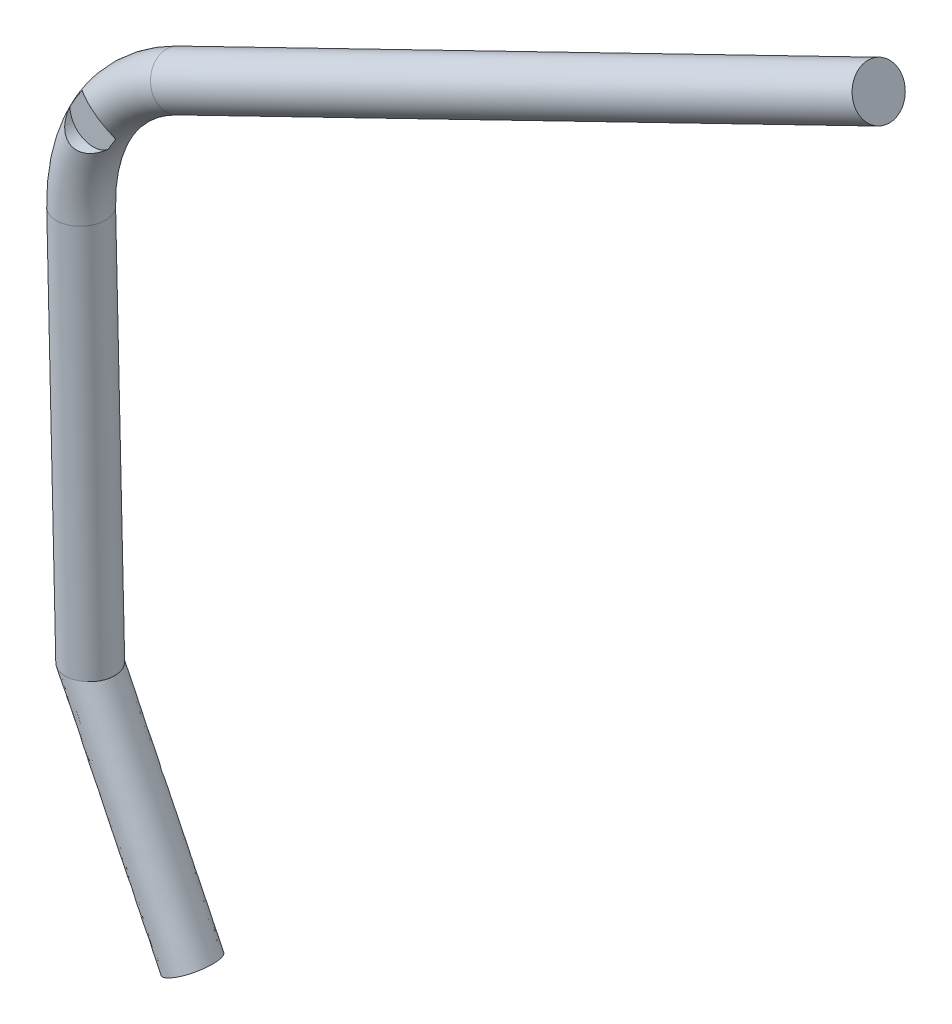
ISO-10303-21;
HEADER;
FILE_DESCRIPTION(('STEP AP214'),'2;1');
FILE_NAME('part.step','',(''),(''),'','','');
FILE_SCHEMA(('AUTOMOTIVE_DESIGN { 1 0 10303 214 1 1 1 1 }'));
ENDSEC;
DATA;
#1=APPLICATION_CONTEXT('core data for automotive mechanical design processes');
#2=APPLICATION_PROTOCOL_DEFINITION('international standard','automotive_design',2000,#1);
#3=PRODUCT_CONTEXT('',#1,'mechanical');
#4=PRODUCT('Part','Part','',(#3));
#5=PRODUCT_RELATED_PRODUCT_CATEGORY('part','',(#4));
#6=PRODUCT_DEFINITION_FORMATION('','',#4);
#7=PRODUCT_DEFINITION_CONTEXT('part definition',#1,'design');
#8=PRODUCT_DEFINITION('design','',#6,#7);
#9=PRODUCT_DEFINITION_SHAPE('','',#8);
#10=(LENGTH_UNIT() NAMED_UNIT(*) SI_UNIT(.MILLI.,.METRE.));
#11=(NAMED_UNIT(*) PLANE_ANGLE_UNIT() SI_UNIT($,.RADIAN.));
#12=(NAMED_UNIT(*) SI_UNIT($,.STERADIAN.) SOLID_ANGLE_UNIT());
#13=UNCERTAINTY_MEASURE_WITH_UNIT(LENGTH_MEASURE(1.E-05),#10,'distance_accuracy_value','');
#14=(GEOMETRIC_REPRESENTATION_CONTEXT(3) GLOBAL_UNCERTAINTY_ASSIGNED_CONTEXT((#13)) GLOBAL_UNIT_ASSIGNED_CONTEXT((#10,
#11,#12)) REPRESENTATION_CONTEXT('',''));
#15=CARTESIAN_POINT('',(0.,0.,0.));
#16=DIRECTION('',(0.,0.,1.));
#17=DIRECTION('',(1.,0.,0.));
#18=AXIS2_PLACEMENT_3D('',#15,#16,#17);
#19=CARTESIAN_POINT('',(0.,0.,0.));
#20=DIRECTION('',(0.,0.,-1.));
#21=DIRECTION('',(-1.,0.,0.));
#22=AXIS2_PLACEMENT_3D('',#19,#20,#21);
#23=TOROIDAL_SURFACE('',#22,88.8758294599473,12.7);
#24=CARTESIAN_POINT('',(-87.7998132979422,50.0474143105984,3.57553745923136));
#25=CARTESIAN_POINT('',(-87.8299343884214,49.9496602388808,3.65134952302277));
#26=CARTESIAN_POINT('',(-87.8586537249685,49.8520629381201,3.72790477899603));
#27=CARTESIAN_POINT('',(-87.913394427294,49.6570338451541,3.88216847786201));
#28=CARTESIAN_POINT('',(-87.9394159847046,49.5596020416772,3.95987683839702));
#29=CARTESIAN_POINT('',(-88.0135880585861,49.2673527472721,4.19421558928203));
#30=CARTESIAN_POINT('',(-88.0578584631124,49.0725406865161,4.35209157645596));
#31=CARTESIAN_POINT('',(-88.136518230025,48.6821553229928,4.66953367030395));
#32=CARTESIAN_POINT('',(-88.1709028266383,48.4865816989811,4.8291005538253));
#33=CARTESIAN_POINT('',(-88.2299477009155,48.0944037382683,5.14876532855746));
#34=CARTESIAN_POINT('',(-88.2546074586819,47.8977993470309,5.30886324769659));
#35=CARTESIAN_POINT('',(-88.3144020102499,47.3028440239459,5.79140496282401));
#36=CARTESIAN_POINT('',(-88.3347040676355,46.9025654278798,6.11344709521728));
#37=CARTESIAN_POINT('',(-88.3350722177534,46.0973182067698,6.75145712930284));
#38=CARTESIAN_POINT('',(-88.3151483084676,45.6923507719888,7.06742652064262));
#39=CARTESIAN_POINT('',(-88.2398999918382,44.9449226361917,7.63917100679886));
#40=CARTESIAN_POINT('',(-88.1908268532016,44.6029531575659,7.89641181514147));
#41=CARTESIAN_POINT('',(-88.061777401501,43.9179879232989,8.40172693100896));
#42=CARTESIAN_POINT('',(-87.9818008179172,43.5749921586999,8.64980115827145));
#43=CARTESIAN_POINT('',(-87.7896643144737,42.8907747760442,9.13359090619045));
#44=CARTESIAN_POINT('',(-87.6775966007258,42.5495508867415,9.36933957850497));
#45=CARTESIAN_POINT('',(-87.419552881972,41.8702593325803,9.82638616496691));
#46=CARTESIAN_POINT('',(-87.273586757567,41.5321907778249,10.0476882659218));
#47=CARTESIAN_POINT('',(-86.9867760067517,40.9452528609873,10.4198829713868));
#48=CARTESIAN_POINT('',(-86.853633944676,40.6950490634719,10.5746289765622));
#49=CARTESIAN_POINT('',(-86.5666715515749,40.1996000175536,10.8725241471734));
#50=CARTESIAN_POINT('',(-86.4128527066865,39.9543544142382,11.0156741448843));
#51=CARTESIAN_POINT('',(-86.0842046828806,39.4707852595166,11.2885153467503));
#52=CARTESIAN_POINT('',(-85.9093895027096,39.2324572261941,11.4182154119624));
#53=CARTESIAN_POINT('',(-85.5384879433511,38.7646585165403,11.6623221709158));
#54=CARTESIAN_POINT('',(-85.3424050977823,38.5351863773678,11.7767313981973));
#55=CARTESIAN_POINT('',(-84.9644973881849,38.1257328915724,11.9701420315276));
#56=CARTESIAN_POINT('',(-84.7859593994598,37.9439938585825,12.0518533427967));
#57=CARTESIAN_POINT('',(-84.4148072344611,37.5897238145778,12.2021732398819));
#58=CARTESIAN_POINT('',(-84.2221957745834,37.4171910376797,12.2707843450499));
#59=CARTESIAN_POINT('',(-83.8236376083874,37.08292683011,12.3937506748177));
#60=CARTESIAN_POINT('',(-83.617696651344,36.9211908029332,12.448111995208));
#61=CARTESIAN_POINT('',(-83.193417833204,36.609995986379,12.5415905325532));
#62=CARTESIAN_POINT('',(-82.9750798366323,36.4605373312127,12.5807075828817));
#63=CARTESIAN_POINT('',(-82.5262791103782,36.1746937918089,12.6430104617389));
#64=CARTESIAN_POINT('',(-82.2957621883338,36.0383765917197,12.6661172497386));
#65=CARTESIAN_POINT('',(-81.8253165797999,35.7810031804306,12.6955114757487));
#66=CARTESIAN_POINT('',(-81.5853878939116,35.6599469682557,12.7017989148339));
#67=CARTESIAN_POINT('',(-81.0981437454259,35.4342048795738,12.6973158610579));
#68=CARTESIAN_POINT('',(-80.8508292880925,35.3295167872167,12.6865476793184));
#69=CARTESIAN_POINT('',(-80.3509348476749,35.1372548289584,12.6480873170022));
#70=CARTESIAN_POINT('',(-80.0983550792081,35.0496802670022,12.6203958249327));
#71=CARTESIAN_POINT('',(-79.6100238156566,34.8982061970104,12.5514015235681));
#72=CARTESIAN_POINT('',(-79.3745030238544,34.8329899219072,12.5113341104027));
#73=CARTESIAN_POINT('',(-78.9024882327816,34.7174494528628,12.4178791712625));
#74=CARTESIAN_POINT('',(-78.6659943176031,34.6671239984452,12.3644927734171));
#75=CARTESIAN_POINT('',(-78.1934992130455,34.5811490707661,12.2452025922946));
#76=CARTESIAN_POINT('',(-77.9574980550108,34.5455005044112,12.1792980358697));
#77=CARTESIAN_POINT('',(-77.4872820138148,34.4884740382499,12.0359063498851));
#78=CARTESIAN_POINT('',(-77.253067494928,34.4670989756142,11.958416921323));
#79=CARTESIAN_POINT('',(-76.7088547346135,34.4331874525968,11.7648799135823));
#80=CARTESIAN_POINT('',(-76.3999929124408,34.4260786387255,11.6446513292095));
#81=CARTESIAN_POINT('',(-75.7895192774033,34.4349340353859,11.3877714448514));
#82=CARTESIAN_POINT('',(-75.4879095861654,34.4509049164097,11.2511154074713));
#83=CARTESIAN_POINT('',(-74.8927603648364,34.5043561329012,10.9635706078729));
#84=CARTESIAN_POINT('',(-74.5992394487436,34.5418823397905,10.8126520679871));
#85=CARTESIAN_POINT('',(-74.0218493516897,34.6369099794594,10.4992376950948));
#86=CARTESIAN_POINT('',(-73.7379802452764,34.6944115664845,10.336741772698));
#87=CARTESIAN_POINT('',(-73.0741813333814,34.8534266410437,9.93878327934594));
#88=CARTESIAN_POINT('',(-72.6987946115488,34.9633615530819,9.69908121405874));
#89=CARTESIAN_POINT('',(-71.9673305382983,35.2158458519965,9.20754527592457));
#90=CARTESIAN_POINT('',(-71.6112641653885,35.3584135467877,8.95570465585365));
#91=CARTESIAN_POINT('',(-70.9180929833421,35.6744571700343,8.44591986826165));
#92=CARTESIAN_POINT('',(-70.5809760034685,35.8479129543598,8.18797977311364));
#93=CARTESIAN_POINT('',(-70.0885038946956,36.1312980875645,7.80168308669395));
#94=CARTESIAN_POINT('',(-69.9265743378705,36.2296074261417,7.67304228311327));
#95=CARTESIAN_POINT('',(-69.6068316107306,36.4342187434557,7.41702035346813));
#96=CARTESIAN_POINT('',(-69.4490179491433,36.5405197623716,7.28963907820386));
#97=CARTESIAN_POINT('',(-69.1520503735626,36.7510072717849,7.04941870527929));
#98=CARTESIAN_POINT('',(-69.012547439413,36.8544362540962,6.93634719432218));
#99=CARTESIAN_POINT('',(-68.7365111639632,37.0685812769834,6.71356286703327));
#100=CARTESIAN_POINT('',(-68.5999773573115,37.1792961645267,6.60384952326109));
#101=CARTESIAN_POINT('',(-68.3296123536961,37.408660839045,6.38933266231237));
#102=CARTESIAN_POINT('',(-68.1957820304026,37.5273131393437,6.2845307183289));
#103=CARTESIAN_POINT('',(-67.9307206045567,37.7732726557532,6.08200623892626));
#104=CARTESIAN_POINT('',(-67.7994891685126,37.9005787519852,5.98428279085436));
#105=CARTESIAN_POINT('',(-67.5654638509713,38.1384480598973,5.81725619685004));
#106=CARTESIAN_POINT('',(-67.4622135447355,38.2472934580679,5.74616989168199));
#107=CARTESIAN_POINT('',(-67.2574858484523,38.4715221968822,5.61227114253804));
#108=CARTESIAN_POINT('',(-67.1560087829472,38.586906718267,5.54946019965959));
#109=CARTESIAN_POINT('',(-66.8552325804855,38.9427896874064,5.37727867459187));
#110=CARTESIAN_POINT('',(-66.658668805733,39.193940704165,5.28346675611695));
#111=CARTESIAN_POINT('',(-66.3240171700661,39.6600745035869,5.17302551316977));
#112=CARTESIAN_POINT('',(-66.1829946395327,39.86980351319,5.14348653057576));
#113=CARTESIAN_POINT('',(-65.9138321646858,40.2990487979367,5.12676214684078));
#114=CARTESIAN_POINT('',(-65.7856877663762,40.5185616510872,5.13956205018238));
#115=CARTESIAN_POINT('',(-65.5465584879697,40.9591548014708,5.20472851149104));
#116=CARTESIAN_POINT('',(-65.4354871733861,41.1802208489147,5.25688729548487));
#117=CARTESIAN_POINT('',(-65.230303918433,41.6207299496285,5.3921467672718));
#118=CARTESIAN_POINT('',(-65.1362180445461,41.8401700210008,5.47529442251456));
#119=CARTESIAN_POINT('',(-64.9513606268091,42.307666182037,5.67731785085569));
#120=CARTESIAN_POINT('',(-64.8631090067675,42.5551873913223,5.79964877957887));
#121=CARTESIAN_POINT('',(-64.7447056139061,42.9233854225159,5.99690443703627));
#122=CARTESIAN_POINT('',(-64.7075522685052,43.0456624100663,6.06498572171099));
#123=CARTESIAN_POINT('',(-64.6376411976712,43.289380034392,6.20483447046372));
#124=CARTESIAN_POINT('',(-64.6048836070504,43.4108206454084,6.27660204750253));
#125=CARTESIAN_POINT('',(-64.519827072758,43.7466260202692,6.47957031656732));
#126=CARTESIAN_POINT('',(-64.471992172455,43.9602693703639,6.61383639099402));
#127=CARTESIAN_POINT('',(-64.3884652390928,44.3863662065031,6.8879955046646));
#128=CARTESIAN_POINT('',(-64.3527776563728,44.5988192284782,7.0278905852294));
#129=CARTESIAN_POINT('',(-64.2929406077791,45.0235313191667,7.31107940201724));
#130=CARTESIAN_POINT('',(-64.2688082268149,45.2357896403882,7.45437784396019));
#131=CARTESIAN_POINT('',(-64.2318573794455,45.6603308076637,7.7423222375931));
#132=CARTESIAN_POINT('',(-64.2190376453445,45.872613648303,7.88696803646194));
#133=CARTESIAN_POINT('',(-64.2045986265583,46.2982008813203,8.17655784982657));
#134=CARTESIAN_POINT('',(-64.2030094008086,46.5115064872719,8.32150162676476));
#135=CARTESIAN_POINT('',(-64.211189714032,46.9388036627893,8.61005876991387));
#136=CARTESIAN_POINT('',(-64.2209607248039,47.1527953176551,8.75367196130803));
#137=CARTESIAN_POINT('',(-64.2675815292631,47.7955258508772,9.18052306585398));
#138=CARTESIAN_POINT('',(-64.3217177221528,48.2256210828644,9.46018840775901));
#139=CARTESIAN_POINT('',(-64.45237690841,48.9426921182728,9.91016956401181));
#140=CARTESIAN_POINT('',(-64.5152037688273,49.2290447385766,10.0855700319632));
#141=CARTESIAN_POINT('',(-64.6634122148531,49.8020213406923,10.4260790874897));
#142=CARTESIAN_POINT('',(-64.7487875279778,50.0886452249846,10.5911905214851));
#143=CARTESIAN_POINT('',(-64.9429508204173,50.6602335931171,10.9082317508876));
#144=CARTESIAN_POINT('',(-65.0516768462903,50.9452004572582,11.060194962324));
#145=CARTESIAN_POINT('',(-65.2937047785839,51.512463399056,11.3487970330013));
#146=CARTESIAN_POINT('',(-65.4270008250225,51.7947600967088,11.4854395337806));
#147=CARTESIAN_POINT('',(-65.6896566109907,52.2982480874488,11.7150978752837));
#148=CARTESIAN_POINT('',(-65.8144475958105,52.520343195127,11.8113679227153));
#149=CARTESIAN_POINT('',(-66.0804049940092,52.9598809897391,11.9909881890255));
#150=CARTESIAN_POINT('',(-66.2215676067338,53.1773247426515,12.0743413960785));
#151=CARTESIAN_POINT('',(-66.5202069405755,53.6059243284992,12.2268018812182));
#152=CARTESIAN_POINT('',(-66.6776825170854,53.8170806012619,12.2959101577917));
#153=CARTESIAN_POINT('',(-67.008553163656,54.231296936833,12.41867709016));
#154=CARTESIAN_POINT('',(-67.1819483817775,54.4343569243166,12.4723356022449));
#155=CARTESIAN_POINT('',(-67.5449243885225,54.8316216539456,12.5634673468455));
#156=CARTESIAN_POINT('',(-67.7345939422062,55.0257676329826,12.6008440431253));
#157=CARTESIAN_POINT('',(-68.128020352962,55.4019996487296,12.6582385222405));
#158=CARTESIAN_POINT('',(-68.3317772673264,55.5840856363866,12.6782562344737));
#159=CARTESIAN_POINT('',(-68.7517380681783,55.9343823806124,12.7005880086158));
#160=CARTESIAN_POINT('',(-68.9679394684223,56.1025958924932,12.7029055944916));
#161=CARTESIAN_POINT('',(-69.4109313338844,56.4236731804454,12.6899031648308));
#162=CARTESIAN_POINT('',(-69.6377211534497,56.5765378906583,12.6745842233771));
#163=CARTESIAN_POINT('',(-70.0780930039358,56.8521740287553,12.6290092704675));
#164=CARTESIAN_POINT('',(-70.2909140157778,56.9764234494745,12.6002918759106));
#165=CARTESIAN_POINT('',(-70.7220571344571,57.2108582017354,12.529306689552));
#166=CARTESIAN_POINT('',(-70.9403810372375,57.3210388686795,12.4870344197602));
#167=CARTESIAN_POINT('',(-71.3808738006058,57.5269526031073,12.3896921964111));
#168=CARTESIAN_POINT('',(-71.6030418307519,57.622688748638,12.3346249757574));
#169=CARTESIAN_POINT('',(-72.0498532429815,57.7996888345419,12.2125417303212));
#170=CARTESIAN_POINT('',(-72.2744969336641,57.8809509485073,12.1455241997194));
#171=CARTESIAN_POINT('',(-72.7388168318284,58.0336929096624,11.9959930655431));
#172=CARTESIAN_POINT('',(-72.978567077956,58.1042625350806,11.9127794693181));
#173=CARTESIAN_POINT('',(-73.4579472778918,58.2295940877472,11.7350798347419));
#174=CARTESIAN_POINT('',(-73.6975772295262,58.2843557389386,11.6405935995757));
#175=CARTESIAN_POINT('',(-74.4148552988826,58.4257217053292,11.3417316820403));
#176=CARTESIAN_POINT('',(-74.8908470577789,58.4893926813656,11.1219674000344));
#177=CARTESIAN_POINT('',(-75.7163776892226,58.5518303367493,10.7072271996906));
#178=CARTESIAN_POINT('',(-76.0686513808671,58.5625720089333,10.5191155484681));
#179=CARTESIAN_POINT('',(-76.7640775786178,58.554119983067,10.1272417253464));
#180=CARTESIAN_POINT('',(-77.1072292172406,58.5349234482558,9.92347807209901));
#181=CARTESIAN_POINT('',(-77.7830971468507,58.4687884508079,9.50279574774767));
#182=CARTESIAN_POINT('',(-78.1158000836747,58.4218158957927,9.28586120477143));
#183=CARTESIAN_POINT('',(-78.7691760119684,58.3022008223453,8.84142304422611));
#184=CARTESIAN_POINT('',(-79.0898517218127,58.2295641436254,8.61392184125491));
#185=CARTESIAN_POINT('',(-79.6248365276804,58.0856457534007,8.21940144925786));
#186=CARTESIAN_POINT('',(-79.8423952006973,58.020396027119,8.05453538873603));
#187=CARTESIAN_POINT('',(-80.2710036665714,57.8787089977975,7.7212568778064));
#188=CARTESIAN_POINT('',(-80.4820544958792,57.8022734874835,7.55284499937657));
#189=CARTESIAN_POINT('',(-80.897272713272,57.6387977494626,7.21329409551479));
#190=CARTESIAN_POINT('',(-81.1014482590126,57.5517706987022,7.04215868435954));
#191=CARTESIAN_POINT('',(-81.503123647986,57.3674279299152,6.69756151953649));
#192=CARTESIAN_POINT('',(-81.70062247424,57.2701106537459,6.5240994170439));
#193=CARTESIAN_POINT('',(-82.1830701608741,57.015868493014,6.09094716743118));
#194=CARTESIAN_POINT('',(-82.4639647528832,56.8529290080994,5.83024760822743));
#195=CARTESIAN_POINT('',(-83.0110009194708,56.5055645316899,5.30763127158959));
#196=CARTESIAN_POINT('',(-83.2771413674682,56.3211379028284,5.04571440285592));
#197=CARTESIAN_POINT('',(-83.6659499206465,56.0278022933731,4.6544770719489));
#198=CARTESIAN_POINT('',(-83.7939409450841,55.9271329030762,4.52420913681484));
#199=CARTESIAN_POINT('',(-84.0465382366391,55.7199942288671,4.26502529569856));
#200=CARTESIAN_POINT('',(-84.171144794178,55.6135254449732,4.13610927429491));
#201=CARTESIAN_POINT('',(-84.4172345203256,55.3943601819849,3.88052398765734));
#202=CARTESIAN_POINT('',(-84.5387171265913,55.2816625929826,3.7538551281906));
#203=CARTESIAN_POINT('',(-84.7789968117145,55.0491777799938,3.50444837261424));
#204=CARTESIAN_POINT('',(-84.8977930645129,54.9293884151634,3.38171168094604));
#205=CARTESIAN_POINT('',(-85.0154399624646,54.8056473199754,3.26181055812029));
#206=B_SPLINE_CURVE_WITH_KNOTS('',3,(#24,#25,#26,#27,#28,#29,#30,#31,#32,#33,#34,#35,#36,#37,
#38,#39,#40,#41,#42,#43,#44,#45,#46,#47,#48,#49,#50,#51,#52,#53,#54,#55,#56,#57,#58,#59,#60,#61,
#62,#63,#64,#65,#66,#67,#68,#69,#70,#71,#72,#73,#74,#75,#76,#77,#78,#79,#80,#81,#82,#83,#84,#85,
#86,#87,#88,#89,#90,#91,#92,#93,#94,#95,#96,#97,#98,#99,#100,#101,#102,#103,#104,#105,#106,#107,
#108,#109,#110,#111,#112,#113,#114,#115,#116,#117,#118,#119,#120,#121,#122,#123,#124,#125,#126,
#127,#128,#129,#130,#131,#132,#133,#134,#135,#136,#137,#138,#139,#140,#141,#142,#143,#144,#145,
#146,#147,#148,#149,#150,#151,#152,#153,#154,#155,#156,#157,#158,#159,#160,#161,#162,#163,#164,
#165,#166,#167,#168,#169,#170,#171,#172,#173,#174,#175,#176,#177,#178,#179,#180,#181,#182,#183,
#184,#185,#186,#187,#188,#189,#190,#191,#192,#193,#194,#195,#196,#197,#198,#199,#200,#201,#202,
#203,#204,#205),.UNSPECIFIED.,.F.,.F.,(4,2,2,2,2,2,2,2,2,2,2,2,2,2,2,2,2,2,2,2,2,2,2,2,2,2,2,2,
2,2,2,2,2,2,2,2,2,2,2,2,2,2,2,2,2,2,2,2,2,2,2,2,2,2,2,2,2,2,2,2,2,2,2,2,2,2,2,2,2,2,2,2,2,2,2,2,
2,2,2,2,2,2,2,2,2,2,2,2,2,2,4),(0.,0.381937258697638,0.763847368501571,1.52750811787588,
2.29153639964258,3.05560552143398,4.59635797919485,6.13672753704977,7.4277962737181,
8.71887631228213,10.0062833393852,11.2933155871119,12.2612557658437,13.2291264113594,
14.196355300192,15.1634237295834,15.965282314016,16.766986534219,17.5683472386562,
18.369716702068,19.1750147591871,19.9803127648532,20.7855016579551,21.5906577949704,
22.3327766441268,23.0748326565102,23.8169345147408,24.5591838380507,25.5522568963553,
26.5456170299856,27.541098985217,28.536588627512,29.9108250606549,31.2858343773026,
32.6599502234297,33.3467671890445,34.0335017975856,34.6550337839132,35.2764676449946,
35.8980992185802,36.5196505000567,37.0173629989499,37.5151656557498,38.5063790915629,
39.2660741014458,40.025505454424,40.780955603378,41.5375554173191,42.4053660154024,
42.8396907920306,43.2740288858283,44.0440530464265,44.8143590132409,45.5858004234736,
46.3571553749669,47.1305741116656,47.9040930613958,49.4489454019008,50.4730883634995,
51.4969467305651,52.5181214641849,53.5390529606865,54.3552990356385,55.1713559978909,
55.9873557398303,56.8033630717482,57.6241448241727,58.4449299148555,59.2655515889145,
60.0861232889042,60.8295992854246,61.5733211502457,62.3168843075598,63.060541225123,
63.8499803605938,64.6394332813244,66.2184849601093,67.4155460025753,68.6127204780941,
69.811367428492,71.0097418096667,71.8514198642838,72.6929631720703,73.5334700166905,
74.3741043133392,75.6225340128332,76.8710589076464,77.4965643382505,78.1220159234651,
78.747579319183,79.37333253067),.UNSPECIFIED.);
#207=CARTESIAN_POINT('',(-88.3343912742981,46.6038788428489,6.35));
#208=VERTEX_POINT('',#207);
#209=CARTESIAN_POINT('',(-68.2787854715161,37.4550714045806,6.34999999999998));
#210=VERTEX_POINT('',#209);
#211=EDGE_CURVE('E79',#208,#210,#206,.T.);
#212=ORIENTED_EDGE('',*,*,#211,.F.);
#213=CARTESIAN_POINT('',(0.,0.,6.35));
#214=DIRECTION('',(0.,0.,1.));
#215=DIRECTION('',(1.,0.,0.));
#216=AXIS2_PLACEMENT_3D('',#213,#214,#215);
#217=CIRCLE('',#216,99.8743520880097);
#218=CARTESIAN_POINT('',(-81.8945354898232,57.167921616111,6.35));
#219=VERTEX_POINT('',#218);
#220=EDGE_CURVE('E53',#208,#219,#217,.F.);
#221=ORIENTED_EDGE('',*,*,#220,.T.);
#222=CARTESIAN_POINT('',(-64.5741252389736,43.5322555010524,6.35));
#223=VERTEX_POINT('',#222);
#224=EDGE_CURVE('E68',#223,#219,#206,.T.);
#225=ORIENTED_EDGE('',*,*,#224,.F.);
#226=CARTESIAN_POINT('',(0.,0.,6.35));
#227=DIRECTION('',(0.,0.,-1.));
#228=DIRECTION('',(-1.,0.,0.));
#229=AXIS2_PLACEMENT_3D('',#226,#227,#228);
#230=CIRCLE('',#229,77.8773068318849);
#231=EDGE_CURVE('E83',#223,#210,#230,.F.);
#232=ORIENTED_EDGE('',*,*,#231,.T.);
#233=EDGE_LOOP('',(#212,#221,#225,#232));
#234=FACE_BOUND('',#233,.T.);
#235=CARTESIAN_POINT('',(-38.8641021219348,79.9280590809602,0.));
#236=DIRECTION('',(0.899322791884384,0.437285394219013,0.));
#237=DIRECTION('',(0.,0.,1.));
#238=AXIS2_PLACEMENT_3D('',#235,#236,#237);
#239=CIRCLE('',#238,12.7);
#240=CARTESIAN_POINT('',(-38.8641021219348,79.9280590809602,12.7));
#241=VERTEX_POINT('',#240);
#242=EDGE_CURVE('E80',#241,#241,#239,.T.);
#243=ORIENTED_EDGE('',*,*,#242,.F.);
#244=EDGE_LOOP('',(#243));
#245=FACE_BOUND('',#244,.T.);
#246=CARTESIAN_POINT('',(-88.851665491492,-2.07234205227966,0.));
#247=DIRECTION('',(0.0233172738288038,-0.999728115409981,0.));
#248=DIRECTION('',(0.999728115409981,0.0233172738288038,0.));
#249=AXIS2_PLACEMENT_3D('',#246,#247,#248);
#250=CIRCLE('',#249,12.7);
#251=CARTESIAN_POINT('',(-76.1551184257853,-1.77621267465385,0.));
#252=VERTEX_POINT('',#251);
#253=EDGE_CURVE('E95',#252,#252,#250,.T.);
#254=ORIENTED_EDGE('',*,*,#253,.F.);
#255=EDGE_LOOP('',(#254));
#256=FACE_BOUND('',#255,.T.);
#257=ADVANCED_FACE('F39',(#234,#245,#256),#23,.T.);
#258=CARTESIAN_POINT('',(326.620680499879,257.640843291567,0.));
#259=DIRECTION('',(-0.899322791884384,-0.437285394219013,0.));
#260=DIRECTION('',(0.437285394219013,-0.899322791884384,0.));
#261=AXIS2_PLACEMENT_3D('',#258,#259,#260);
#262=CYLINDRICAL_SURFACE('',#261,12.7);
#263=CARTESIAN_POINT('',(326.620680499879,257.640843291567,0.));
#264=DIRECTION('',(0.899322791884384,0.437285394219013,0.));
#265=DIRECTION('',(-0.437285394219013,0.899322791884384,0.));
#266=AXIS2_PLACEMENT_3D('',#263,#264,#265);
#267=CIRCLE('',#266,12.7);
#268=CARTESIAN_POINT('',(321.067155993297,269.062242748499,0.));
#269=VERTEX_POINT('',#268);
#270=EDGE_CURVE('E94',#269,#269,#267,.T.);
#271=ORIENTED_EDGE('',*,*,#270,.F.);
#272=EDGE_LOOP('',(#271));
#273=FACE_BOUND('',#272,.T.);
#274=ORIENTED_EDGE('',*,*,#242,.T.);
#275=EDGE_LOOP('',(#274));
#276=FACE_BOUND('',#275,.T.);
#277=ADVANCED_FACE('F126',(#273,#276),#262,.T.);
#278=CARTESIAN_POINT('',(326.620680499879,257.640843291567,0.));
#279=DIRECTION('',(0.899322791884384,0.437285394219013,0.));
#280=DIRECTION('',(-0.437285394219013,0.899322791884384,0.));
#281=AXIS2_PLACEMENT_3D('',#278,#279,#280);
#282=PLANE('',#281);
#283=ORIENTED_EDGE('',*,*,#270,.T.);
#284=EDGE_LOOP('',(#283));
#285=FACE_BOUND('',#284,.T.);
#286=ADVANCED_FACE('F123',(#285),#282,.T.);
#287=CARTESIAN_POINT('',(-84.1135954494791,-205.217095103588,0.));
#288=DIRECTION('',(-0.0233172738288038,0.999728115409981,0.));
#289=DIRECTION('',(-0.999728115409981,-0.0233172738288038,0.));
#290=AXIS2_PLACEMENT_3D('',#287,#288,#289);
#291=CYLINDRICAL_SURFACE('',#290,12.7);
#292=CARTESIAN_POINT('',(-84.1135954494791,-205.217095103588,0.));
#293=DIRECTION('',(0.0233172738288038,-0.999728115409981,0.));
#294=DIRECTION('',(0.999728115409981,0.0233172738288038,0.));
#295=AXIS2_PLACEMENT_3D('',#292,#293,#294);
#296=CIRCLE('',#295,12.7);
#297=CARTESIAN_POINT('',(-71.4170483837723,-204.920965725962,0.));
#298=VERTEX_POINT('',#297);
#299=EDGE_CURVE('E91',#298,#298,#296,.T.);
#300=ORIENTED_EDGE('',*,*,#299,.F.);
#301=EDGE_LOOP('',(#300));
#302=FACE_BOUND('',#301,.T.);
#303=ORIENTED_EDGE('',*,*,#253,.T.);
#304=EDGE_LOOP('',(#303));
#305=FACE_BOUND('',#304,.T.);
#306=ADVANCED_FACE('F120',(#302,#305),#291,.T.);
#307=CARTESIAN_POINT('',(-76.2698894916076,46.4942351678984,6.35));
#308=DIRECTION('',(0.,0.,1.));
#309=DIRECTION('',(1.,0.,0.));
#310=AXIS2_PLACEMENT_3D('',#307,#308,#309);
#311=CYLINDRICAL_SURFACE('',#310,12.065);
#312=CARTESIAN_POINT('',(-76.2698894916076,46.4942351678984,6.35));
#313=DIRECTION('',(0.,0.,1.));
#314=DIRECTION('',(1.,0.,0.));
#315=AXIS2_PLACEMENT_3D('',#312,#313,#314);
#316=CIRCLE('',#315,12.065);
#317=EDGE_CURVE('E60',#208,#210,#316,.T.);
#318=ORIENTED_EDGE('',*,*,#317,.F.);
#319=ORIENTED_EDGE('',*,*,#211,.T.);
#320=EDGE_LOOP('',(#318,#319));
#321=FACE_BOUND('',#320,.T.);
#322=ADVANCED_FACE('F119',(#321),#311,.F.);
#323=EDGE_CURVE('E77',#223,#219,#316,.T.);
#324=ORIENTED_EDGE('',*,*,#323,.F.);
#325=ORIENTED_EDGE('',*,*,#224,.T.);
#326=EDGE_LOOP('',(#324,#325));
#327=FACE_BOUND('',#326,.T.);
#328=ADVANCED_FACE('F76',(#327),#311,.F.);
#329=CARTESIAN_POINT('',(-76.2698894916076,46.4942351678984,6.35));
#330=DIRECTION('',(0.,0.,1.));
#331=DIRECTION('',(1.,0.,0.));
#332=AXIS2_PLACEMENT_3D('',#329,#330,#331);
#333=PLANE('',#332);
#334=ORIENTED_EDGE('',*,*,#317,.T.);
#335=ORIENTED_EDGE('',*,*,#231,.F.);
#336=ORIENTED_EDGE('',*,*,#323,.T.);
#337=ORIENTED_EDGE('',*,*,#220,.F.);
#338=EDGE_LOOP('',(#334,#335,#336,#337));
#339=FACE_BOUND('',#338,.T.);
#340=ADVANCED_FACE('F82',(#339),#333,.T.);
#341=CARTESIAN_POINT('',(-71.4170483837723,-204.920965725962,0.));
#342=CARTESIAN_POINT('',(-15.8818033179577,-319.134960295279,0.));
#343=CARTESIAN_POINT('',(-71.4170483837723,-204.920965725962,25.4));
#344=CARTESIAN_POINT('',(-15.8818033179577,-319.134960295279,25.4));
#345=CARTESIAN_POINT('',(-96.8101425151859,-205.513224481214,25.4));
#346=CARTESIAN_POINT('',(-41.2748974493712,-319.72721905053,25.4));
#347=CARTESIAN_POINT('',(-96.8101425151859,-205.513224481214,0.));
#348=CARTESIAN_POINT('',(-41.2748974493712,-319.72721905053,0.));
#349=CARTESIAN_POINT('',(-96.8101425151859,-205.513224481214,-25.4));
#350=CARTESIAN_POINT('',(-41.2748974493712,-319.72721905053,-25.4));
#351=CARTESIAN_POINT('',(-71.4170483837723,-204.920965725962,-25.4));
#352=CARTESIAN_POINT('',(-15.8818033179577,-319.134960295279,-25.4));
#353=CARTESIAN_POINT('',(-71.4170483837723,-204.920965725962,0.));
#354=CARTESIAN_POINT('',(-15.8818033179577,-319.134960295279,0.));
#355=(BOUNDED_SURFACE() B_SPLINE_SURFACE(3,1,((#341,#342),(#343,#344),(#345,#346),(#347,#348),
(#349,#350),(#351,#352),(#353,#354)),.UNSPECIFIED.,.T.,.F.,.F.) B_SPLINE_SURFACE_WITH_KNOTS((4,
3,4),(2,2),(0.,0.5,1.),(0.,1.),
.UNSPECIFIED.) GEOMETRIC_REPRESENTATION_ITEM() RATIONAL_B_SPLINE_SURFACE(((1.,1.),
(0.333333333333333,0.333333333333333),(0.333333333333333,0.333333333333333),(1.,1.),
(0.333333333333333,0.333333333333333),(0.333333333333333,0.333333333333333),(1.,1.))) REPRESENTATION_ITEM('') SURFACE());
#356=CARTESIAN_POINT('',(-20.5045209888939,-309.627861689014,0.));
#357=CARTESIAN_POINT('',(-20.5045204251193,-309.627861414885,0.385772176738716));
#358=CARTESIAN_POINT('',(-20.5188962786039,-309.634851508781,0.771521162680156));
#359=CARTESIAN_POINT('',(-20.5763703388342,-309.662797611462,1.54049588212366));
#360=CARTESIAN_POINT('',(-20.6194770619748,-309.683757761246,1.92372083342736));
#361=CARTESIAN_POINT('',(-20.7343726038837,-309.739624400889,2.68526164187033));
#362=CARTESIAN_POINT('',(-20.8061933640124,-309.774546421869,3.06357154602822));
#363=CARTESIAN_POINT('',(-20.9783524151045,-309.858256786162,3.81227798923771));
#364=CARTESIAN_POINT('',(-21.0787036772067,-309.907051436542,4.18267084633215));
#365=CARTESIAN_POINT('',(-21.3078051703053,-310.018449410251,4.91320554888954));
#366=CARTESIAN_POINT('',(-21.4366066738813,-310.081077664283,5.27332754419128));
#367=CARTESIAN_POINT('',(-21.7219776456472,-310.219836026701,5.97950910768473));
#368=CARTESIAN_POINT('',(-21.8785333357016,-310.295959435627,6.32557554924334));
#369=CARTESIAN_POINT('',(-22.2187946115724,-310.46140757894,7.00074349498674));
#370=CARTESIAN_POINT('',(-22.4024957738325,-310.550730162424,7.32984775152195));
#371=CARTESIAN_POINT('',(-22.7962041674439,-310.742166353813,7.9679988613027));
#372=CARTESIAN_POINT('',(-23.0062095419429,-310.844279058845,8.27704712799406));
#373=CARTESIAN_POINT('',(-23.4392621897423,-311.054845942637,8.85566818807819));
#374=CARTESIAN_POINT('',(-23.6609766953365,-311.162652078385,9.12647415583995));
#375=CARTESIAN_POINT('',(-24.1256571532597,-311.388597622146,9.64449453395367));
#376=CARTESIAN_POINT('',(-24.3686202886869,-311.506735660473,9.89171206233412));
#377=CARTESIAN_POINT('',(-24.8741713799435,-311.752554080992,10.3597302007581));
#378=CARTESIAN_POINT('',(-25.1367510085792,-311.880230414182,10.5805419176917));
#379=CARTESIAN_POINT('',(-25.6797337733376,-312.144249556679,10.9931726500152));
#380=CARTESIAN_POINT('',(-25.960135059318,-312.280591466376,11.1849946679885));
#381=CARTESIAN_POINT('',(-26.5092214675164,-312.5475784355,11.520464058));
#382=CARTESIAN_POINT('',(-26.776505085477,-312.677542029554,11.6669522485444));
#383=CARTESIAN_POINT('',(-27.3219077915059,-312.942737840743,11.9324182754371));
#384=CARTESIAN_POINT('',(-27.6000261907864,-313.077969722961,12.0513978572365));
#385=CARTESIAN_POINT('',(-28.1648009791935,-313.352584987049,12.2603439242459));
#386=CARTESIAN_POINT('',(-28.4514531819945,-313.491966333365,12.3503243871317));
#387=CARTESIAN_POINT('',(-29.0310506158595,-313.773788938823,12.500195996868));
#388=CARTESIAN_POINT('',(-29.3239954675826,-313.916230013514,12.5600889522108));
#389=CARTESIAN_POINT('',(-29.8898685114863,-314.191379291742,12.6454172294231));
#390=CARTESIAN_POINT('',(-30.1625074884501,-314.323946867697,12.6732402786809));
#391=CARTESIAN_POINT('',(-30.7089192612755,-314.589633326043,12.7024776142314));
#392=CARTESIAN_POINT('',(-30.9826919837407,-314.722752172747,12.7038935841376));
#393=CARTESIAN_POINT('',(-31.5292599314062,-314.988514569318,12.6803046708576));
#394=CARTESIAN_POINT('',(-31.8020553314184,-315.121158204186,12.6553047764595));
#395=CARTESIAN_POINT('',(-32.3446800396983,-315.385003245827,12.579177260026));
#396=CARTESIAN_POINT('',(-32.6145093489918,-315.516204653098,12.5280496470277));
#397=CARTESIAN_POINT('',(-33.1419093628968,-315.772646861694,12.4019900711706));
#398=CARTESIAN_POINT('',(-33.3996135691676,-315.89795257667,12.3277466849382));
#399=CARTESIAN_POINT('',(-33.9086160129674,-316.145449177784,12.1558547359555));
#400=CARTESIAN_POINT('',(-34.1599144261499,-316.267640149331,12.0582068157469));
#401=CARTESIAN_POINT('',(-34.6545248603094,-316.508138800803,11.8404699273004));
#402=CARTESIAN_POINT('',(-34.8978365175348,-316.626446303858,11.7203799386157));
#403=CARTESIAN_POINT('',(-35.3750150220117,-316.858468879429,11.4588981317907));
#404=CARTESIAN_POINT('',(-35.6088815815482,-316.972183812048,11.3175056653576));
#405=CARTESIAN_POINT('',(-36.0734185285056,-317.198059575247,11.0096845029059));
#406=CARTESIAN_POINT('',(-36.3037283569346,-317.310045088153,10.8425832468062));
#407=CARTESIAN_POINT('',(-36.7516277704972,-317.527831041537,10.4885063766617));
#408=CARTESIAN_POINT('',(-36.9692171718016,-317.63363139263,10.3015304755089));
#409=CARTESIAN_POINT('',(-37.3906385351474,-317.838542697743,9.90924160427311));
#410=CARTESIAN_POINT('',(-37.594468131749,-317.937652501595,9.703925495359));
#411=CARTESIAN_POINT('',(-37.987435553415,-318.128728403873,9.27657647122567));
#412=CARTESIAN_POINT('',(-38.1765720816192,-318.220693871715,9.05454208379254));
#413=CARTESIAN_POINT('',(-38.5531476558131,-318.40379942614,8.57795817342086));
#414=CARTESIAN_POINT('',(-38.7393704035285,-318.494348101634,8.32221976771044));
#415=CARTESIAN_POINT('',(-39.0931541468321,-318.666371389663,7.79526102938013));
#416=CARTESIAN_POINT('',(-39.2607143384825,-318.747845611291,7.52404003056815));
#417=CARTESIAN_POINT('',(-39.5765805800194,-318.901431948919,6.96803989790045));
#418=CARTESIAN_POINT('',(-39.7248843613493,-318.973542961859,6.68325917199363));
#419=CARTESIAN_POINT('',(-40.0017850479501,-319.108182745252,6.10197857470384));
#420=CARTESIAN_POINT('',(-40.1303749163321,-319.170708094098,5.80547456597556));
#421=CARTESIAN_POINT('',(-40.3780217363013,-319.291123520322,5.17572598393398));
#422=CARTESIAN_POINT('',(-40.4951992473673,-319.348099741299,4.84156630141119));
#423=CARTESIAN_POINT('',(-40.7053485263038,-319.450282418213,4.16381773333317));
#424=CARTESIAN_POINT('',(-40.798309430019,-319.495483591579,3.82022469188996));
#425=CARTESIAN_POINT('',(-40.9597179615958,-319.573966639043,3.12596414895636));
#426=CARTESIAN_POINT('',(-41.0281633849943,-319.607247441246,2.77529601425801));
#427=CARTESIAN_POINT('',(-41.1403624333815,-319.661802941838,2.06910517270408));
#428=CARTESIAN_POINT('',(-41.1841149380225,-319.683077095471,1.71358224633013));
#429=CARTESIAN_POINT('',(-41.2490241545134,-319.714638457618,0.974781733817051));
#430=CARTESIAN_POINT('',(-41.2683798522176,-319.724049943658,0.591307166168184));
#431=CARTESIAN_POINT('',(-41.2786399287133,-319.729038788192,-0.176111572041552));
#432=CARTESIAN_POINT('',(-41.2695437976788,-319.72461589879,-0.560055750894115));
#433=CARTESIAN_POINT('',(-41.2229169746321,-319.701944140795,-1.32590747074563));
#434=CARTESIAN_POINT('',(-41.1853790163177,-319.683691739046,-1.7078144661731));
#435=CARTESIAN_POINT('',(-41.0819587287353,-319.633404810221,-2.46684716254687));
#436=CARTESIAN_POINT('',(-41.0160771572812,-319.601370651624,-2.84397299104817));
#437=CARTESIAN_POINT('',(-40.8545115674296,-319.522811236375,-3.5984299900732));
#438=CARTESIAN_POINT('',(-40.7582451035388,-319.476002772282,-3.97560734306452));
#439=CARTESIAN_POINT('',(-40.5367281833423,-319.368292710168,-4.71914162037733));
#440=CARTESIAN_POINT('',(-40.4114888603919,-319.307396525614,-5.08550264025118));
#441=CARTESIAN_POINT('',(-40.132426013071,-319.171705416366,-5.80460064470115));
#442=CARTESIAN_POINT('',(-39.9785977615133,-319.096908193132,-6.15733536449734));
#443=CARTESIAN_POINT('',(-39.6429972253501,-318.933726281052,-6.84597620960705));
#444=CARTESIAN_POINT('',(-39.4612264887222,-318.845342344894,-7.18188326578543));
#445=CARTESIAN_POINT('',(-39.0790178483553,-318.659497776642,-7.81958359236808));
#446=CARTESIAN_POINT('',(-38.8797224504773,-318.562592674921,-8.12222322644934));
#447=CARTESIAN_POINT('',(-38.4573231293579,-318.357205849056,-8.70620421566484));
#448=CARTESIAN_POINT('',(-38.2342215384684,-318.24872525899,-8.98754765263217));
#449=CARTESIAN_POINT('',(-37.765564797238,-318.020846293071,-9.52588169511523));
#450=CARTESIAN_POINT('',(-37.5200190417529,-317.901452485358,-9.78288239930365));
#451=CARTESIAN_POINT('',(-37.0080037792817,-317.652490935716,-10.2696815602841));
#452=CARTESIAN_POINT('',(-36.7415363998971,-317.522924228309,-10.4994827771536));
#453=CARTESIAN_POINT('',(-36.2143001692334,-317.266561657436,-10.9098192250306));
#454=CARTESIAN_POINT('',(-35.955145048005,-317.140550451701,-11.0929209022585));
#455=CARTESIAN_POINT('',(-35.4229184804369,-316.881761386737,-11.4320889977498));
#456=CARTESIAN_POINT('',(-35.149848993541,-316.748984480264,-11.5881592090864));
#457=CARTESIAN_POINT('',(-34.5919692438713,-316.477721849691,-11.8713222179595));
#458=CARTESIAN_POINT('',(-34.3071648917183,-316.339238999561,-11.9984293979259));
#459=CARTESIAN_POINT('',(-33.7280209412592,-316.05763689521,-12.2221240159405));
#460=CARTESIAN_POINT('',(-33.433682085322,-315.914518001956,-12.3187138238441));
#461=CARTESIAN_POINT('',(-32.8648128146398,-315.637911842817,-12.4728266890304));
#462=CARTESIAN_POINT('',(-32.5908782010707,-315.504714278421,-12.5330797187762));
#463=CARTESIAN_POINT('',(-32.0393087788302,-315.236519972194,-12.6265400141577));
#464=CARTESIAN_POINT('',(-31.7616742264347,-315.101523354974,-12.6597491431923));
#465=CARTESIAN_POINT('',(-31.2049279449031,-314.830811860284,-12.6987262047741));
#466=CARTESIAN_POINT('',(-30.9258166357075,-314.695097187006,-12.7045015585725));
#467=CARTESIAN_POINT('',(-30.3682300268845,-314.423977092807,-12.6885622140071));
#468=CARTESIAN_POINT('',(-30.0897547186697,-314.288571667712,-12.6668478890366));
#469=CARTESIAN_POINT('',(-29.5480657020715,-314.025181595421,-12.5977781746041));
#470=CARTESIAN_POINT('',(-29.2847280082539,-313.89713666173,-12.5516174243236));
#471=CARTESIAN_POINT('',(-28.7624651963017,-313.643192358671,-12.4349548755865));
#472=CARTESIAN_POINT('',(-28.5035398669179,-313.517292886585,-12.3644542458961));
#473=CARTESIAN_POINT('',(-27.9918433499479,-313.268486323288,-12.1998459594616));
#474=CARTESIAN_POINT('',(-27.739072073585,-313.145579188909,-12.105738643483));
#475=CARTESIAN_POINT('',(-27.2412931711248,-312.903539906062,-11.8948564433073));
#476=CARTESIAN_POINT('',(-26.9962859066502,-312.784407933427,-11.7780805050789));
#477=CARTESIAN_POINT('',(-26.511503495121,-312.548688045253,-11.520845793301));
#478=CARTESIAN_POINT('',(-26.271884479578,-312.432176046869,-11.3800234577));
#479=CARTESIAN_POINT('',(-25.8036473967116,-312.204501135017,-11.0774502682387));
#480=CARTESIAN_POINT('',(-25.5750276329528,-312.093337396675,-10.915702656011));
#481=CARTESIAN_POINT('',(-25.1299979160554,-311.876946800386,-10.5727101159638));
#482=CARTESIAN_POINT('',(-24.9135863420186,-311.771719154295,-10.3914677858171));
#483=CARTESIAN_POINT('',(-24.4938518949211,-311.567628092862,-10.0108366111259));
#484=CARTESIAN_POINT('',(-24.2905381156841,-311.468769099288,-9.81143538580578));
#485=CARTESIAN_POINT('',(-23.8851972225677,-311.271676738415,-9.38251758610572));
#486=CARTESIAN_POINT('',(-23.6841257528813,-311.173908042145,-9.15188406634655));
#487=CARTESIAN_POINT('',(-23.2988617682869,-310.986577847801,-8.67364462861472));
#488=CARTESIAN_POINT('',(-23.1146766398663,-310.897019941321,-8.42603136529701));
#489=CARTESIAN_POINT('',(-22.7639602480587,-310.726488117782,-7.9157004164254));
#490=CARTESIAN_POINT('',(-22.5974341284198,-310.645516701811,-7.65297836413779));
#491=CARTESIAN_POINT('',(-22.2826760788261,-310.492469209806,-7.11430994845128));
#492=CARTESIAN_POINT('',(-22.1344455620331,-310.420393820907,-6.83836256580363));
#493=CARTESIAN_POINT('',(-21.8442346841537,-310.279282109645,-6.24963874148094));
#494=CARTESIAN_POINT('',(-21.7040210768248,-310.211104851035,-5.93578425395203));
#495=CARTESIAN_POINT('',(-21.4464819312891,-310.085879394949,-5.29703173869507));
#496=CARTESIAN_POINT('',(-21.3291361021859,-310.028821331257,-4.97214380450639));
#497=CARTESIAN_POINT('',(-21.1175561535967,-309.925943007631,-4.31334908576457));
#498=CARTESIAN_POINT('',(-21.0233124366346,-309.880118081035,-3.97944611061386));
#499=CARTESIAN_POINT('',(-20.8581210853373,-309.799795680862,-3.30461212367883));
#500=CARTESIAN_POINT('',(-20.7871738052239,-309.765298379523,-2.96368100511546));
#501=CARTESIAN_POINT('',(-20.6535708010131,-309.70033545087,-2.18879952393541));
#502=CARTESIAN_POINT('',(-20.5976908253633,-309.673164453535,-1.75338591097661));
#503=CARTESIAN_POINT('',(-20.5231654271716,-309.636927333314,-0.878638287760076));
#504=CARTESIAN_POINT('',(-20.5045216309011,-309.627862001182,-0.439304107115199));
#505=CARTESIAN_POINT('',(-20.5045209888939,-309.627861689014,0.));
#506=B_SPLINE_CURVE_WITH_KNOTS('',3,(#356,#357,#358,#359,#360,#361,#362,#363,#364,#365,#366,
#367,#368,#369,#370,#371,#372,#373,#374,#375,#376,#377,#378,#379,#380,#381,#382,#383,#384,#385,
#386,#387,#388,#389,#390,#391,#392,#393,#394,#395,#396,#397,#398,#399,#400,#401,#402,#403,#404,
#405,#406,#407,#408,#409,#410,#411,#412,#413,#414,#415,#416,#417,#418,#419,#420,#421,#422,#423,
#424,#425,#426,#427,#428,#429,#430,#431,#432,#433,#434,#435,#436,#437,#438,#439,#440,#441,#442,
#443,#444,#445,#446,#447,#448,#449,#450,#451,#452,#453,#454,#455,#456,#457,#458,#459,#460,#461,
#462,#463,#464,#465,#466,#467,#468,#469,#470,#471,#472,#473,#474,#475,#476,#477,#478,#479,#480,
#481,#482,#483,#484,#485,#486,#487,#488,#489,#490,#491,#492,#493,#494,#495,#496,#497,#498,#499,
#500,#501,#502,#503,#504,#505),.UNSPECIFIED.,.T.,.F.,(4,2,2,2,2,2,2,2,2,2,2,2,2,2,2,2,2,2,2,2,2,
2,2,2,2,2,2,2,2,2,2,2,2,2,2,2,2,2,2,2,2,2,2,2,2,2,2,2,2,2,2,2,2,2,2,2,2,2,2,2,2,2,2,2,2,2,2,2,2,
2,2,2,2,2,4),(0.,1.15694493303883,2.31423295992932,3.47281194655385,4.63191851543917,
5.79313130341194,6.95376923137871,8.11421823292475,9.27458536281838,10.3717701193704,
11.4688096434864,12.5653860923507,13.6618488862823,14.6545731076768,15.647234322348,
16.639416352783,17.6315387382503,18.5437149255231,19.4558329557643,20.3677787580421,
21.2797242448975,22.1667526025917,23.0537566108398,23.9408009612125,24.8278723122338,
25.7442362776552,26.6606134826251,27.5771478223774,28.4937629668757,29.4798852620285,
30.4660500205335,31.4523308517948,32.4389629207721,33.5137835524568,34.5890855474685,
35.6644842107378,36.7399316622285,37.8908446655257,39.0417782920561,40.1930060576615,
41.3442030451778,42.5189648294523,43.6932759374947,44.8677813912372,46.0422218023295,
47.1660338505695,48.2897358970707,49.4129697109081,50.5360894463038,51.5589771539033,
52.5817212127361,53.6039562862507,54.6261119576104,55.5564459331113,56.4867158006271,
57.416734001732,58.3467395705031,59.2350020769657,60.1232219362597,61.0114289747227,
61.8996773223737,62.8027875459069,63.7057580315644,64.6086083450347,65.5120788995686,
66.4746976677651,67.4377355191232,68.4010531197931,69.3644450811082,70.4146467805954,
71.463912335649,72.5127412452253,73.5615861014896,74.8790177238249,76.1965068830659),.UNSPECIFIED.);
#507=CARTESIAN_POINT('',(-20.5045209888939,-309.627861689014,0.));
#508=VERTEX_POINT('',#507);
#509=EDGE_CURVE('E11',#508,#508,#506,.T.);
#510=CARTESIAN_POINT('',(-20.5045209888939,-309.627861689014,0.));
#511=CARTESIAN_POINT('',(-21.0348598159239,-308.537164856065,0.));
#512=CARTESIAN_POINT('',(-21.5651986429539,-307.446468023117,0.));
#513=CARTESIAN_POINT('',(-22.6258762970138,-305.26507435722,0.));
#514=CARTESIAN_POINT('',(-23.1562151240438,-304.174377524271,0.));
#515=CARTESIAN_POINT('',(-24.2168927781038,-301.992983858375,0.));
#516=CARTESIAN_POINT('',(-24.7472316051338,-300.902287025426,0.));
#517=CARTESIAN_POINT('',(-25.8079092591937,-298.720893359529,0.));
#518=CARTESIAN_POINT('',(-26.3382480862237,-297.630196526581,0.));
#519=CARTESIAN_POINT('',(-27.3989257402837,-295.448802860684,0.));
#520=CARTESIAN_POINT('',(-27.9292645673137,-294.358106027735,0.));
#521=CARTESIAN_POINT('',(-28.9899422213736,-292.176712361838,0.));
#522=CARTESIAN_POINT('',(-29.5202810484036,-291.08601552889,0.));
#523=CARTESIAN_POINT('',(-30.5809587024636,-288.904621862993,0.));
#524=CARTESIAN_POINT('',(-31.1112975294936,-287.813925030045,0.));
#525=CARTESIAN_POINT('',(-32.1719751835535,-285.632531364148,0.));
#526=CARTESIAN_POINT('',(-32.7023140105835,-284.541834531199,0.));
#527=CARTESIAN_POINT('',(-33.7629916646435,-282.360440865302,0.));
#528=CARTESIAN_POINT('',(-34.2933304916735,-281.269744032354,0.));
#529=CARTESIAN_POINT('',(-35.3540081457334,-279.088350366457,0.));
#530=CARTESIAN_POINT('',(-35.8843469727634,-277.997653533509,0.));
#531=CARTESIAN_POINT('',(-36.9450246268234,-275.816259867612,0.));
#532=CARTESIAN_POINT('',(-37.4753634538534,-274.725563034663,0.));
#533=CARTESIAN_POINT('',(-38.5360411079133,-272.544169368766,0.));
#534=CARTESIAN_POINT('',(-39.0663799349433,-271.453472535818,0.));
#535=CARTESIAN_POINT('',(-40.1270575890033,-269.272078869921,0.));
#536=CARTESIAN_POINT('',(-40.6573964160333,-268.181382036972,0.));
#537=CARTESIAN_POINT('',(-41.7180740700932,-265.999988371076,0.));
#538=CARTESIAN_POINT('',(-42.2484128971232,-264.909291538127,0.));
#539=CARTESIAN_POINT('',(-43.3090905511832,-262.72789787223,0.));
#540=CARTESIAN_POINT('',(-43.8394293782132,-261.637201039282,0.));
#541=CARTESIAN_POINT('',(-44.9001070322731,-259.455807373385,0.));
#542=CARTESIAN_POINT('',(-45.4304458593031,-258.365110540436,0.));
#543=CARTESIAN_POINT('',(-46.4911235133631,-256.183716874539,0.));
#544=CARTESIAN_POINT('',(-47.0214623403931,-255.093020041591,0.));
#545=CARTESIAN_POINT('',(-48.082139994453,-252.911626375694,0.));
#546=CARTESIAN_POINT('',(-48.612478821483,-251.820929542746,0.));
#547=CARTESIAN_POINT('',(-49.673156475543,-249.639535876849,0.));
#548=CARTESIAN_POINT('',(-50.203495302573,-248.5488390439,0.));
#549=CARTESIAN_POINT('',(-51.2641729566329,-246.367445378003,0.));
#550=CARTESIAN_POINT('',(-51.7945117836629,-245.276748545055,0.));
#551=CARTESIAN_POINT('',(-52.8551894377229,-243.095354879158,0.));
#552=CARTESIAN_POINT('',(-53.3855282647529,-242.00465804621,0.));
#553=CARTESIAN_POINT('',(-54.4462059188128,-239.823264380313,0.));
#554=CARTESIAN_POINT('',(-54.9765447458428,-238.732567547364,0.));
#555=CARTESIAN_POINT('',(-56.0372223999028,-236.551173881467,0.));
#556=CARTESIAN_POINT('',(-56.5675612269328,-235.460477048519,0.));
#557=CARTESIAN_POINT('',(-57.6282388809927,-233.279083382622,0.));
#558=CARTESIAN_POINT('',(-58.1585777080227,-232.188386549673,0.));
#559=CARTESIAN_POINT('',(-59.2192553620827,-230.006992883776,0.));
#560=CARTESIAN_POINT('',(-59.7495941891127,-228.916296050828,0.));
#561=CARTESIAN_POINT('',(-60.8102718431726,-226.734902384931,0.));
#562=CARTESIAN_POINT('',(-61.3406106702026,-225.644205551983,0.));
#563=CARTESIAN_POINT('',(-62.4012883242626,-223.462811886086,0.));
#564=CARTESIAN_POINT('',(-62.9316271512926,-222.372115053137,0.));
#565=CARTESIAN_POINT('',(-63.9923048053525,-220.19072138724,0.));
#566=CARTESIAN_POINT('',(-64.5226436323825,-219.100024554292,0.));
#567=CARTESIAN_POINT('',(-65.5833212864425,-216.918630888395,0.));
#568=CARTESIAN_POINT('',(-66.1136601134725,-215.827934055447,0.));
#569=CARTESIAN_POINT('',(-67.1743377675324,-213.64654038955,0.));
#570=CARTESIAN_POINT('',(-67.7046765945624,-212.555843556601,0.));
#571=CARTESIAN_POINT('',(-68.7653542486224,-210.374449890704,0.));
#572=CARTESIAN_POINT('',(-69.2956930756524,-209.283753057756,0.));
#573=CARTESIAN_POINT('',(-70.3563707297123,-207.102359391859,0.));
#574=CARTESIAN_POINT('',(-70.8867095567423,-206.011662558911,0.));
#575=CARTESIAN_POINT('',(-71.4170483837723,-204.920965725962,0.));
#576=B_SPLINE_CURVE_WITH_KNOTS('',3,(#510,#511,#512,#513,#514,#515,#516,#517,#518,#519,#520,
#521,#522,#523,#524,#525,#526,#527,#528,#529,#530,#531,#532,#533,#534,#535,#536,#537,#538,#539,
#540,#541,#542,#543,#544,#545,#546,#547,#548,#549,#550,#551,#552,#553,#554,#555,#556,#557,#558,
#559,#560,#561,#562,#563,#564,#565,#566,#567,#568,#569,#570,#571,#572,#573,#574,#575),
.UNSPECIFIED.,.F.,.F.,(4,2,2,2,2,2,2,2,2,2,2,2,2,2,2,2,2,2,2,2,2,2,2,2,2,2,2,2,2,2,2,2,4),(0.,
3.63839383186234,7.27678766372468,10.915181495587,14.5535753274494,18.1919691593117,
21.830362991174,25.4687568230364,29.1071506548987,32.7455444867611,36.3839383186234,
40.0223321504857,43.6607259823481,47.2991198142105,50.9375136460728,54.5759074779351,
58.2143013097975,61.8526951416598,65.4910889735222,69.1294828053845,72.7678766372468,
76.4062704691092,80.0446643009715,83.6830581328339,87.3214519646963,90.9598457965586,
94.5982396284209,98.2366334602833,101.875027292146,105.513421124008,109.15181495587,
112.790208787733,116.428602619595),.UNSPECIFIED.);
#577=EDGE_CURVE('BSEAM167',#508,#298,#576,.T.);
#578=ORIENTED_EDGE('',*,*,#509,.F.);
#579=ORIENTED_EDGE('',*,*,#299,.T.);
#580=ORIENTED_EDGE('',*,*,#577,.T.);
#581=ORIENTED_EDGE('',*,*,#577,.F.);
#582=EDGE_LOOP('',(#578,#580,#579,#581));
#583=FACE_BOUND('',#582,.T.);
#584=ADVANCED_FACE('F167',(#583),#355,.T.);
#585=CARTESIAN_POINT('',(-41.2748974493712,-319.72721905053,-12.7));
#586=DIRECTION('',(-0.437285394219017,0.899322791884382,0.));
#587=DIRECTION('',(-0.899322791884382,-0.437285394219017,0.));
#588=AXIS2_PLACEMENT_3D('',#585,#586,#587);
#589=PLANE('',#588);
#590=ORIENTED_EDGE('',*,*,#509,.T.);
#591=EDGE_LOOP('',(#590));
#592=FACE_BOUND('',#591,.T.);
#593=ADVANCED_FACE('F180',(#592),#589,.F.);
#594=CLOSED_SHELL('',(#257,#277,#286,#306,#322,#328,#340,#584,#593));
#595=MANIFOLD_SOLID_BREP('B2',#594);
#596=ADVANCED_BREP_SHAPE_REPRESENTATION('',(#18,#595),#14);
#597=SHAPE_DEFINITION_REPRESENTATION(#9,#596);
ENDSEC;
END-ISO-10303-21;
